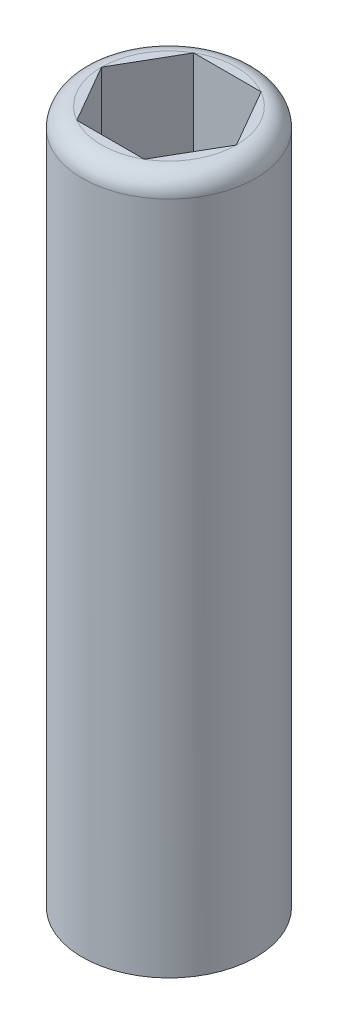
ISO-10303-21;
HEADER;
FILE_DESCRIPTION(('STEP AP214'),'2;1');
FILE_NAME('part.step','',(''),(''),'','','');
FILE_SCHEMA(('AUTOMOTIVE_DESIGN { 1 0 10303 214 1 1 1 1 }'));
ENDSEC;
DATA;
#1=APPLICATION_CONTEXT('core data for automotive mechanical design processes');
#2=APPLICATION_PROTOCOL_DEFINITION('international standard','automotive_design',2000,#1);
#3=PRODUCT_CONTEXT('',#1,'mechanical');
#4=PRODUCT('Part','Part','',(#3));
#5=PRODUCT_RELATED_PRODUCT_CATEGORY('part','',(#4));
#6=PRODUCT_DEFINITION_FORMATION('','',#4);
#7=PRODUCT_DEFINITION_CONTEXT('part definition',#1,'design');
#8=PRODUCT_DEFINITION('design','',#6,#7);
#9=PRODUCT_DEFINITION_SHAPE('','',#8);
#10=(LENGTH_UNIT() NAMED_UNIT(*) SI_UNIT(.MILLI.,.METRE.));
#11=(NAMED_UNIT(*) PLANE_ANGLE_UNIT() SI_UNIT($,.RADIAN.));
#12=(NAMED_UNIT(*) SI_UNIT($,.STERADIAN.) SOLID_ANGLE_UNIT());
#13=UNCERTAINTY_MEASURE_WITH_UNIT(LENGTH_MEASURE(1.E-05),#10,'distance_accuracy_value','');
#14=(GEOMETRIC_REPRESENTATION_CONTEXT(3) GLOBAL_UNCERTAINTY_ASSIGNED_CONTEXT((#13)) GLOBAL_UNIT_ASSIGNED_CONTEXT((#10,
#11,#12)) REPRESENTATION_CONTEXT('',''));
#15=CARTESIAN_POINT('',(0.,0.,0.));
#16=DIRECTION('',(0.,0.,1.));
#17=DIRECTION('',(1.,0.,0.));
#18=AXIS2_PLACEMENT_3D('',#15,#16,#17);
#19=CARTESIAN_POINT('',(29.,36.980048463865,8.324011643679));
#20=DIRECTION('',(0.,-1.,0.));
#21=DIRECTION('',(-1.,0.,0.));
#22=AXIS2_PLACEMENT_3D('',#19,#20,#21);
#23=PLANE('',#22);
#24=DIRECTION('',(0.499999999999997,0.,-0.86602540378444));
#25=VECTOR('',#24,1.);
#26=CARTESIAN_POINT('',(28.65,36.980048463865,7.71779386102989));
#27=LINE('',#26,#25);
#28=CARTESIAN_POINT('',(28.3,36.980048463865,8.324011643679));
#29=VERTEX_POINT('',#28);
#30=CARTESIAN_POINT('',(28.65,36.980048463865,7.71779386102989));
#31=VERTEX_POINT('',#30);
#32=EDGE_CURVE('E102',#29,#31,#27,.T.);
#33=ORIENTED_EDGE('',*,*,#32,.T.);
#34=CARTESIAN_POINT('',(29.,36.980048463865,8.324011643679));
#35=DIRECTION('',(0.,-1.,0.));
#36=DIRECTION('',(0.,0.,-1.));
#37=AXIS2_PLACEMENT_3D('',#34,#35,#36);
#38=CIRCLE('',#37,0.7);
#39=EDGE_CURVE('E11',#31,#29,#38,.F.);
#40=ORIENTED_EDGE('',*,*,#39,.T.);
#41=EDGE_LOOP('',(#33,#40));
#42=FACE_BOUND('',#41,.T.);
#43=ADVANCED_FACE('F46',(#42),#23,.F.);
#44=DIRECTION('',(-0.499999999999999,0.,-0.86602540378444));
#45=VECTOR('',#44,1.);
#46=CARTESIAN_POINT('',(28.3,36.980048463865,8.324011643679));
#47=LINE('',#46,#45);
#48=CARTESIAN_POINT('',(28.65,36.980048463865,8.93022942632811));
#49=VERTEX_POINT('',#48);
#50=EDGE_CURVE('E138',#49,#29,#47,.T.);
#51=ORIENTED_EDGE('',*,*,#50,.T.);
#52=CARTESIAN_POINT('',(29.,36.980048463865,8.324011643679));
#53=DIRECTION('',(0.,-1.,0.));
#54=DIRECTION('',(0.,0.,-1.));
#55=AXIS2_PLACEMENT_3D('',#52,#53,#54);
#56=CIRCLE('',#55,0.7);
#57=EDGE_CURVE('E54',#29,#49,#56,.F.);
#58=ORIENTED_EDGE('',*,*,#57,.T.);
#59=EDGE_LOOP('',(#51,#58));
#60=FACE_BOUND('',#59,.T.);
#61=ADVANCED_FACE('F164',(#60),#23,.F.);
#62=DIRECTION('',(-1.,0.,0.));
#63=VECTOR('',#62,1.);
#64=CARTESIAN_POINT('',(28.65,36.980048463865,8.93022942632811));
#65=LINE('',#64,#63);
#66=CARTESIAN_POINT('',(29.35,36.980048463865,8.93022942632811));
#67=VERTEX_POINT('',#66);
#68=EDGE_CURVE('E142',#67,#49,#65,.T.);
#69=ORIENTED_EDGE('',*,*,#68,.T.);
#70=CARTESIAN_POINT('',(29.,36.980048463865,8.324011643679));
#71=DIRECTION('',(0.,-1.,0.));
#72=DIRECTION('',(0.,0.,-1.));
#73=AXIS2_PLACEMENT_3D('',#70,#71,#72);
#74=CIRCLE('',#73,0.7);
#75=EDGE_CURVE('E162',#49,#67,#74,.F.);
#76=ORIENTED_EDGE('',*,*,#75,.T.);
#77=EDGE_LOOP('',(#69,#76));
#78=FACE_BOUND('',#77,.T.);
#79=ADVANCED_FACE('F167',(#78),#23,.F.);
#80=DIRECTION('',(-0.499999999999999,0.,0.866025403784439));
#81=VECTOR('',#80,1.);
#82=CARTESIAN_POINT('',(29.35,36.980048463865,8.93022942632811));
#83=LINE('',#82,#81);
#84=CARTESIAN_POINT('',(29.7,36.980048463865,8.324011643679));
#85=VERTEX_POINT('',#84);
#86=EDGE_CURVE('E145',#85,#67,#83,.T.);
#87=ORIENTED_EDGE('',*,*,#86,.T.);
#88=CARTESIAN_POINT('',(29.,36.980048463865,8.324011643679));
#89=DIRECTION('',(0.,-1.,0.));
#90=DIRECTION('',(0.,0.,-1.));
#91=AXIS2_PLACEMENT_3D('',#88,#89,#90);
#92=CIRCLE('',#91,0.7);
#93=EDGE_CURVE('E160',#67,#85,#92,.F.);
#94=ORIENTED_EDGE('',*,*,#93,.T.);
#95=EDGE_LOOP('',(#87,#94));
#96=FACE_BOUND('',#95,.T.);
#97=ADVANCED_FACE('F176',(#96),#23,.F.);
#98=DIRECTION('',(0.5,0.,0.866025403784439));
#99=VECTOR('',#98,1.);
#100=CARTESIAN_POINT('',(29.7,36.980048463865,8.324011643679));
#101=LINE('',#100,#99);
#102=CARTESIAN_POINT('',(29.35,36.980048463865,7.71779386102989));
#103=VERTEX_POINT('',#102);
#104=EDGE_CURVE('E126',#103,#85,#101,.T.);
#105=ORIENTED_EDGE('',*,*,#104,.T.);
#106=CARTESIAN_POINT('',(29.,36.980048463865,8.324011643679));
#107=DIRECTION('',(0.,-1.,0.));
#108=DIRECTION('',(0.,0.,-1.));
#109=AXIS2_PLACEMENT_3D('',#106,#107,#108);
#110=CIRCLE('',#109,0.7);
#111=EDGE_CURVE('E158',#85,#103,#110,.F.);
#112=ORIENTED_EDGE('',*,*,#111,.T.);
#113=EDGE_LOOP('',(#105,#112));
#114=FACE_BOUND('',#113,.T.);
#115=ADVANCED_FACE('F180',(#114),#23,.F.);
#116=DIRECTION('',(1.,0.,0.));
#117=VECTOR('',#116,1.);
#118=CARTESIAN_POINT('',(29.35,36.980048463865,7.71779386102989));
#119=LINE('',#118,#117);
#120=EDGE_CURVE('E124',#31,#103,#119,.T.);
#121=ORIENTED_EDGE('',*,*,#120,.T.);
#122=CARTESIAN_POINT('',(29.,36.980048463865,8.324011643679));
#123=DIRECTION('',(0.,-1.,0.));
#124=DIRECTION('',(0.,0.,-1.));
#125=AXIS2_PLACEMENT_3D('',#122,#123,#124);
#126=CIRCLE('',#125,0.7);
#127=EDGE_CURVE('E156',#103,#31,#126,.F.);
#128=ORIENTED_EDGE('',*,*,#127,.T.);
#129=EDGE_LOOP('',(#121,#128));
#130=FACE_BOUND('',#129,.T.);
#131=ADVANCED_FACE('F202',(#130),#23,.F.);
#132=CARTESIAN_POINT('',(29.,29.780048463865,8.324011643679));
#133=DIRECTION('',(0.,-1.,0.));
#134=DIRECTION('',(-1.,0.,0.));
#135=AXIS2_PLACEMENT_3D('',#132,#133,#134);
#136=PLANE('',#135);
#137=CARTESIAN_POINT('',(29.,29.780048463865,8.324011643679));
#138=DIRECTION('',(0.,-1.,0.));
#139=DIRECTION('',(1.,0.,0.));
#140=AXIS2_PLACEMENT_3D('',#137,#138,#139);
#141=CIRCLE('',#140,0.9);
#142=CARTESIAN_POINT('',(29.9,29.780048463865,8.324011643679));
#143=VERTEX_POINT('',#142);
#144=EDGE_CURVE('E141',#143,#143,#141,.T.);
#145=ORIENTED_EDGE('',*,*,#144,.T.);
#146=EDGE_LOOP('',(#145));
#147=FACE_BOUND('',#146,.T.);
#148=ADVANCED_FACE('F208',(#147),#136,.T.);
#149=CARTESIAN_POINT('',(29.,34.780048463865,8.324011643679));
#150=DIRECTION('',(0.,-1.,0.));
#151=DIRECTION('',(-1.,0.,0.));
#152=AXIS2_PLACEMENT_3D('',#149,#150,#151);
#153=CYLINDRICAL_SURFACE('',#152,0.9);
#154=CARTESIAN_POINT('',(29.,36.780048463865,8.324011643679));
#155=DIRECTION('',(0.,-1.,0.));
#156=DIRECTION('',(0.,0.,-1.));
#157=AXIS2_PLACEMENT_3D('',#154,#155,#156);
#158=CIRCLE('',#157,0.9);
#159=CARTESIAN_POINT('',(29.,36.780048463865,7.424011643679));
#160=VERTEX_POINT('',#159);
#161=EDGE_CURVE('E153',#160,#160,#158,.T.);
#162=ORIENTED_EDGE('',*,*,#161,.T.);
#163=EDGE_LOOP('',(#162));
#164=FACE_BOUND('',#163,.T.);
#165=ORIENTED_EDGE('',*,*,#144,.F.);
#166=EDGE_LOOP('',(#165));
#167=FACE_BOUND('',#166,.T.);
#168=ADVANCED_FACE('F209',(#164,#167),#153,.T.);
#169=CARTESIAN_POINT('',(28.65,39.5256328761366,7.71779386102989));
#170=DIRECTION('',(0.86602540378444,0.,0.499999999999997));
#171=DIRECTION('',(0.499999999999997,0.,-0.86602540378444));
#172=AXIS2_PLACEMENT_3D('',#169,#170,#171);
#173=PLANE('',#172);
#174=ORIENTED_EDGE('',*,*,#32,.F.);
#175=DIRECTION('',(0.,-1.,0.));
#176=VECTOR('',#175,1.);
#177=CARTESIAN_POINT('',(28.3,39.5256328761366,8.324011643679));
#178=LINE('',#177,#176);
#179=CARTESIAN_POINT('',(28.3,35.980048463865,8.324011643679));
#180=VERTEX_POINT('',#179);
#181=EDGE_CURVE('E98',#29,#180,#178,.T.);
#182=ORIENTED_EDGE('',*,*,#181,.T.);
#183=DIRECTION('',(-0.499999999999997,0.,0.86602540378444));
#184=VECTOR('',#183,1.);
#185=CARTESIAN_POINT('',(28.65,35.980048463865,7.71779386102989));
#186=LINE('',#185,#184);
#187=CARTESIAN_POINT('',(28.65,35.980048463865,7.71779386102989));
#188=VERTEX_POINT('',#187);
#189=EDGE_CURVE('E61',#188,#180,#186,.T.);
#190=ORIENTED_EDGE('',*,*,#189,.F.);
#191=DIRECTION('',(0.,-1.,0.));
#192=VECTOR('',#191,1.);
#193=CARTESIAN_POINT('',(28.65,39.5256328761366,7.71779386102989));
#194=LINE('',#193,#192);
#195=EDGE_CURVE('E135',#31,#188,#194,.T.);
#196=ORIENTED_EDGE('',*,*,#195,.F.);
#197=EDGE_LOOP('',(#174,#182,#190,#196));
#198=FACE_BOUND('',#197,.T.);
#199=ADVANCED_FACE('F100',(#198),#173,.T.);
#200=CARTESIAN_POINT('',(28.3,39.5256328761366,8.324011643679));
#201=DIRECTION('',(0.86602540378444,0.,-0.499999999999999));
#202=DIRECTION('',(-0.499999999999999,0.,-0.86602540378444));
#203=AXIS2_PLACEMENT_3D('',#200,#201,#202);
#204=PLANE('',#203);
#205=ORIENTED_EDGE('',*,*,#50,.F.);
#206=DIRECTION('',(0.,-1.,0.));
#207=VECTOR('',#206,1.);
#208=CARTESIAN_POINT('',(28.65,39.5256328761366,8.93022942632811));
#209=LINE('',#208,#207);
#210=CARTESIAN_POINT('',(28.65,35.980048463865,8.93022942632811));
#211=VERTEX_POINT('',#210);
#212=EDGE_CURVE('E105',#49,#211,#209,.T.);
#213=ORIENTED_EDGE('',*,*,#212,.T.);
#214=DIRECTION('',(0.499999999999999,0.,0.866025403784439));
#215=VECTOR('',#214,1.);
#216=CARTESIAN_POINT('',(28.3,35.980048463865,8.324011643679));
#217=LINE('',#216,#215);
#218=EDGE_CURVE('E109',#180,#211,#217,.T.);
#219=ORIENTED_EDGE('',*,*,#218,.F.);
#220=ORIENTED_EDGE('',*,*,#181,.F.);
#221=EDGE_LOOP('',(#205,#213,#219,#220));
#222=FACE_BOUND('',#221,.T.);
#223=ADVANCED_FACE('F110',(#222),#204,.T.);
#224=CARTESIAN_POINT('',(28.65,39.5256328761366,8.93022942632811));
#225=DIRECTION('',(0.,0.,-1.));
#226=DIRECTION('',(-1.,0.,0.));
#227=AXIS2_PLACEMENT_3D('',#224,#225,#226);
#228=PLANE('',#227);
#229=ORIENTED_EDGE('',*,*,#68,.F.);
#230=DIRECTION('',(0.,-1.,0.));
#231=VECTOR('',#230,1.);
#232=CARTESIAN_POINT('',(29.35,39.5256328761366,8.93022942632811));
#233=LINE('',#232,#231);
#234=CARTESIAN_POINT('',(29.35,35.980048463865,8.93022942632811));
#235=VERTEX_POINT('',#234);
#236=EDGE_CURVE('E129',#67,#235,#233,.T.);
#237=ORIENTED_EDGE('',*,*,#236,.T.);
#238=DIRECTION('',(1.,0.,0.));
#239=VECTOR('',#238,1.);
#240=CARTESIAN_POINT('',(28.65,35.980048463865,8.93022942632811));
#241=LINE('',#240,#239);
#242=EDGE_CURVE('E115',#211,#235,#241,.T.);
#243=ORIENTED_EDGE('',*,*,#242,.F.);
#244=ORIENTED_EDGE('',*,*,#212,.F.);
#245=EDGE_LOOP('',(#229,#237,#243,#244));
#246=FACE_BOUND('',#245,.T.);
#247=ADVANCED_FACE('F170',(#246),#228,.T.);
#248=CARTESIAN_POINT('',(29.35,39.5256328761366,8.93022942632811));
#249=DIRECTION('',(-0.866025403784439,0.,-0.499999999999999));
#250=DIRECTION('',(-0.499999999999999,0.,0.866025403784439));
#251=AXIS2_PLACEMENT_3D('',#248,#249,#250);
#252=PLANE('',#251);
#253=ORIENTED_EDGE('',*,*,#86,.F.);
#254=DIRECTION('',(0.,-1.,0.));
#255=VECTOR('',#254,1.);
#256=CARTESIAN_POINT('',(29.7,39.5256328761366,8.324011643679));
#257=LINE('',#256,#255);
#258=CARTESIAN_POINT('',(29.7,35.980048463865,8.324011643679));
#259=VERTEX_POINT('',#258);
#260=EDGE_CURVE('E131',#85,#259,#257,.T.);
#261=ORIENTED_EDGE('',*,*,#260,.T.);
#262=DIRECTION('',(0.499999999999999,0.,-0.866025403784439));
#263=VECTOR('',#262,1.);
#264=CARTESIAN_POINT('',(29.35,35.980048463865,8.93022942632811));
#265=LINE('',#264,#263);
#266=EDGE_CURVE('E191',#235,#259,#265,.T.);
#267=ORIENTED_EDGE('',*,*,#266,.F.);
#268=ORIENTED_EDGE('',*,*,#236,.F.);
#269=EDGE_LOOP('',(#253,#261,#267,#268));
#270=FACE_BOUND('',#269,.T.);
#271=ADVANCED_FACE('F185',(#270),#252,.T.);
#272=CARTESIAN_POINT('',(29.7,39.5256328761366,8.324011643679));
#273=DIRECTION('',(-0.866025403784439,0.,0.5));
#274=DIRECTION('',(0.5,0.,0.866025403784439));
#275=AXIS2_PLACEMENT_3D('',#272,#273,#274);
#276=PLANE('',#275);
#277=ORIENTED_EDGE('',*,*,#104,.F.);
#278=DIRECTION('',(0.,-1.,0.));
#279=VECTOR('',#278,1.);
#280=CARTESIAN_POINT('',(29.35,39.5256328761366,7.71779386102989));
#281=LINE('',#280,#279);
#282=CARTESIAN_POINT('',(29.35,35.980048463865,7.71779386102989));
#283=VERTEX_POINT('',#282);
#284=EDGE_CURVE('E133',#103,#283,#281,.T.);
#285=ORIENTED_EDGE('',*,*,#284,.T.);
#286=DIRECTION('',(-0.5,0.,-0.866025403784438));
#287=VECTOR('',#286,1.);
#288=CARTESIAN_POINT('',(29.7,35.980048463865,8.324011643679));
#289=LINE('',#288,#287);
#290=EDGE_CURVE('E189',#259,#283,#289,.T.);
#291=ORIENTED_EDGE('',*,*,#290,.F.);
#292=ORIENTED_EDGE('',*,*,#260,.F.);
#293=EDGE_LOOP('',(#277,#285,#291,#292));
#294=FACE_BOUND('',#293,.T.);
#295=ADVANCED_FACE('F188',(#294),#276,.T.);
#296=CARTESIAN_POINT('',(29.35,39.5256328761366,7.71779386102989));
#297=DIRECTION('',(0.,0.,1.));
#298=DIRECTION('',(1.,0.,0.));
#299=AXIS2_PLACEMENT_3D('',#296,#297,#298);
#300=PLANE('',#299);
#301=ORIENTED_EDGE('',*,*,#120,.F.);
#302=ORIENTED_EDGE('',*,*,#195,.T.);
#303=DIRECTION('',(-1.,0.,0.));
#304=VECTOR('',#303,1.);
#305=CARTESIAN_POINT('',(29.35,35.980048463865,7.71779386102989));
#306=LINE('',#305,#304);
#307=EDGE_CURVE('E106',#283,#188,#306,.T.);
#308=ORIENTED_EDGE('',*,*,#307,.F.);
#309=ORIENTED_EDGE('',*,*,#284,.F.);
#310=EDGE_LOOP('',(#301,#302,#308,#309));
#311=FACE_BOUND('',#310,.T.);
#312=ADVANCED_FACE('F197',(#311),#300,.T.);
#313=CARTESIAN_POINT('',(29.,35.980048463865,8.324011643679));
#314=DIRECTION('',(0.,-1.,0.));
#315=DIRECTION('',(-1.,0.,0.));
#316=AXIS2_PLACEMENT_3D('',#313,#314,#315);
#317=PLANE('',#316);
#318=ORIENTED_EDGE('',*,*,#307,.T.);
#319=ORIENTED_EDGE('',*,*,#189,.T.);
#320=ORIENTED_EDGE('',*,*,#218,.T.);
#321=ORIENTED_EDGE('',*,*,#242,.T.);
#322=ORIENTED_EDGE('',*,*,#266,.T.);
#323=ORIENTED_EDGE('',*,*,#290,.T.);
#324=EDGE_LOOP('',(#318,#319,#320,#321,#322,#323));
#325=FACE_BOUND('',#324,.T.);
#326=ADVANCED_FACE('F118',(#325),#317,.F.);
#327=CARTESIAN_POINT('',(29.,36.780048463865,8.324011643679));
#328=DIRECTION('',(0.,-1.,0.));
#329=DIRECTION('',(0.,0.,-1.));
#330=AXIS2_PLACEMENT_3D('',#327,#328,#329);
#331=TOROIDAL_SURFACE('',#330,0.7,0.2);
#332=ORIENTED_EDGE('',*,*,#57,.F.);
#333=ORIENTED_EDGE('',*,*,#39,.F.);
#334=ORIENTED_EDGE('',*,*,#127,.F.);
#335=ORIENTED_EDGE('',*,*,#111,.F.);
#336=ORIENTED_EDGE('',*,*,#93,.F.);
#337=ORIENTED_EDGE('',*,*,#75,.F.);
#338=EDGE_LOOP('',(#332,#333,#334,#335,#336,#337));
#339=FACE_BOUND('',#338,.T.);
#340=ORIENTED_EDGE('',*,*,#161,.F.);
#341=EDGE_LOOP('',(#340));
#342=FACE_BOUND('',#341,.T.);
#343=ADVANCED_FACE('F48',(#339,#342),#331,.T.);
#344=CLOSED_SHELL('',(#43,#61,#79,#97,#115,#131,#148,#168,#199,#223,#247,#271,#295,#312,#326,#343));
#345=MANIFOLD_SOLID_BREP('B2',#344);
#346=ADVANCED_BREP_SHAPE_REPRESENTATION('',(#18,#345),#14);
#347=SHAPE_DEFINITION_REPRESENTATION(#9,#346);
ENDSEC;
END-ISO-10303-21;
